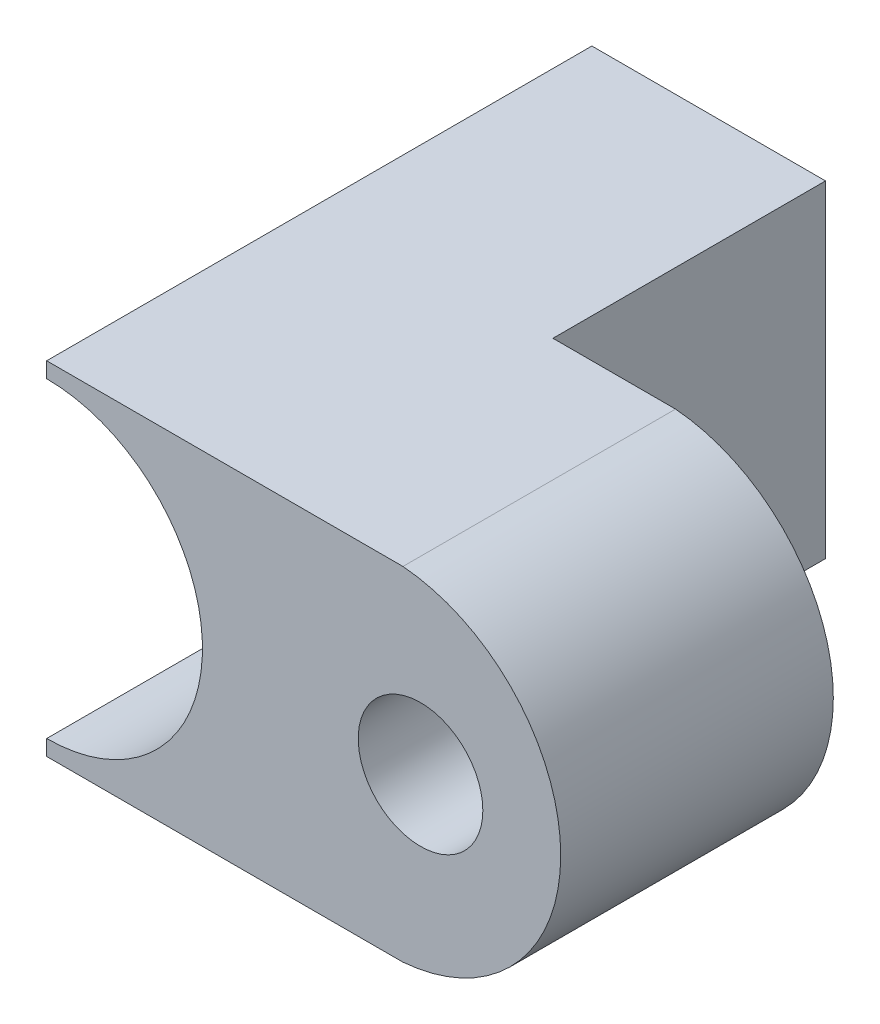
ISO-10303-21;
HEADER;
FILE_DESCRIPTION(('STEP AP214'),'2;1');
FILE_NAME('part.step','',(''),(''),'','','');
FILE_SCHEMA(('AUTOMOTIVE_DESIGN { 1 0 10303 214 1 1 1 1 }'));
ENDSEC;
DATA;
#1=APPLICATION_CONTEXT('core data for automotive mechanical design processes');
#2=APPLICATION_PROTOCOL_DEFINITION('international standard','automotive_design',2000,#1);
#3=PRODUCT_CONTEXT('',#1,'mechanical');
#4=PRODUCT('Part','Part','',(#3));
#5=PRODUCT_RELATED_PRODUCT_CATEGORY('part','',(#4));
#6=PRODUCT_DEFINITION_FORMATION('','',#4);
#7=PRODUCT_DEFINITION_CONTEXT('part definition',#1,'design');
#8=PRODUCT_DEFINITION('design','',#6,#7);
#9=PRODUCT_DEFINITION_SHAPE('','',#8);
#10=(LENGTH_UNIT() NAMED_UNIT(*) SI_UNIT(.MILLI.,.METRE.));
#11=(NAMED_UNIT(*) PLANE_ANGLE_UNIT() SI_UNIT($,.RADIAN.));
#12=(NAMED_UNIT(*) SI_UNIT($,.STERADIAN.) SOLID_ANGLE_UNIT());
#13=UNCERTAINTY_MEASURE_WITH_UNIT(LENGTH_MEASURE(1.E-05),#10,'distance_accuracy_value','');
#14=(GEOMETRIC_REPRESENTATION_CONTEXT(3) GLOBAL_UNCERTAINTY_ASSIGNED_CONTEXT((#13)) GLOBAL_UNIT_ASSIGNED_CONTEXT((#10,
#11,#12)) REPRESENTATION_CONTEXT('',''));
#15=CARTESIAN_POINT('',(0.,0.,0.));
#16=DIRECTION('',(0.,0.,1.));
#17=DIRECTION('',(1.,0.,0.));
#18=AXIS2_PLACEMENT_3D('',#15,#16,#17);
#19=CARTESIAN_POINT('',(27.8923885019855,12.7,44.45));
#20=DIRECTION('',(0.,0.,-1.));
#21=DIRECTION('',(-1.,0.,0.));
#22=AXIS2_PLACEMENT_3D('',#19,#20,#21);
#23=CYLINDRICAL_SURFACE('',#22,14.0176114980145);
#24=CARTESIAN_POINT('',(27.8923885019855,12.7,22.225));
#25=DIRECTION('',(0.,0.,-1.));
#26=DIRECTION('',(-1.,0.,0.));
#27=AXIS2_PLACEMENT_3D('',#24,#25,#26);
#28=CIRCLE('',#27,14.0176114980145);
#29=CARTESIAN_POINT('',(29.0467420480314,26.67,22.225));
#30=VERTEX_POINT('',#29);
#31=CARTESIAN_POINT('',(29.0467420480314,-1.27,22.225));
#32=VERTEX_POINT('',#31);
#33=EDGE_CURVE('E144',#30,#32,#28,.T.);
#34=ORIENTED_EDGE('',*,*,#33,.F.);
#35=DIRECTION('',(0.,0.,-1.));
#36=VECTOR('',#35,1.);
#37=CARTESIAN_POINT('',(29.0467420480314,26.67,44.45));
#38=LINE('',#37,#36);
#39=CARTESIAN_POINT('',(29.0467420480314,26.67,44.45));
#40=VERTEX_POINT('',#39);
#41=EDGE_CURVE('E150',#40,#30,#38,.T.);
#42=ORIENTED_EDGE('',*,*,#41,.F.);
#43=CARTESIAN_POINT('',(27.8923885019855,12.7,44.45));
#44=DIRECTION('',(0.,0.,1.));
#45=DIRECTION('',(1.,0.,0.));
#46=AXIS2_PLACEMENT_3D('',#43,#44,#45);
#47=CIRCLE('',#46,14.0176114980145);
#48=CARTESIAN_POINT('',(29.0467420480314,-1.27,44.45));
#49=VERTEX_POINT('',#48);
#50=EDGE_CURVE('E174',#49,#40,#47,.T.);
#51=ORIENTED_EDGE('',*,*,#50,.F.);
#52=DIRECTION('',(0.,0.,-1.));
#53=VECTOR('',#52,1.);
#54=CARTESIAN_POINT('',(29.0467420480314,-1.27,44.45));
#55=LINE('',#54,#53);
#56=EDGE_CURVE('E200',#49,#32,#55,.T.);
#57=ORIENTED_EDGE('',*,*,#56,.T.);
#58=EDGE_LOOP('',(#34,#42,#51,#57));
#59=FACE_BOUND('',#58,.T.);
#60=ADVANCED_FACE('F53',(#59),#23,.T.);
#61=CARTESIAN_POINT('',(0.,25.4,44.45));
#62=DIRECTION('',(1.,0.,0.));
#63=DIRECTION('',(0.,1.,0.));
#64=AXIS2_PLACEMENT_3D('',#61,#62,#63);
#65=PLANE('',#64);
#66=DIRECTION('',(0.,-1.,0.));
#67=VECTOR('',#66,1.);
#68=CARTESIAN_POINT('',(0.,25.4,0.));
#69=LINE('',#68,#67);
#70=CARTESIAN_POINT('',(0.,26.67,0.));
#71=VERTEX_POINT('',#70);
#72=CARTESIAN_POINT('',(0.,25.4,0.));
#73=VERTEX_POINT('',#72);
#74=EDGE_CURVE('E143',#71,#73,#69,.T.);
#75=ORIENTED_EDGE('',*,*,#74,.T.);
#76=DIRECTION('',(0.,0.,-1.));
#77=VECTOR('',#76,1.);
#78=CARTESIAN_POINT('',(0.,25.4,44.45));
#79=LINE('',#78,#77);
#80=CARTESIAN_POINT('',(0.,25.4,44.45));
#81=VERTEX_POINT('',#80);
#82=EDGE_CURVE('E212',#81,#73,#79,.T.);
#83=ORIENTED_EDGE('',*,*,#82,.F.);
#84=DIRECTION('',(0.,-1.,0.));
#85=VECTOR('',#84,1.);
#86=CARTESIAN_POINT('',(0.,25.4,44.45));
#87=LINE('',#86,#85);
#88=CARTESIAN_POINT('',(0.,26.67,44.45));
#89=VERTEX_POINT('',#88);
#90=EDGE_CURVE('E160',#89,#81,#87,.T.);
#91=ORIENTED_EDGE('',*,*,#90,.F.);
#92=DIRECTION('',(0.,0.,-1.));
#93=VECTOR('',#92,1.);
#94=CARTESIAN_POINT('',(0.,26.67,44.45));
#95=LINE('',#94,#93);
#96=EDGE_CURVE('E180',#89,#71,#95,.T.);
#97=ORIENTED_EDGE('',*,*,#96,.T.);
#98=EDGE_LOOP('',(#75,#83,#91,#97));
#99=FACE_BOUND('',#98,.T.);
#100=ADVANCED_FACE('F235',(#99),#65,.F.);
#101=CARTESIAN_POINT('',(0.,12.7,44.45));
#102=DIRECTION('',(0.,0.,-1.));
#103=DIRECTION('',(-1.,0.,0.));
#104=AXIS2_PLACEMENT_3D('',#101,#102,#103);
#105=CYLINDRICAL_SURFACE('',#104,12.7);
#106=CARTESIAN_POINT('',(0.,12.7,0.));
#107=DIRECTION('',(0.,0.,-1.));
#108=DIRECTION('',(1.,0.,0.));
#109=AXIS2_PLACEMENT_3D('',#106,#107,#108);
#110=CIRCLE('',#109,12.7);
#111=CARTESIAN_POINT('',(0.,0.,0.));
#112=VERTEX_POINT('',#111);
#113=EDGE_CURVE('E184',#73,#112,#110,.T.);
#114=ORIENTED_EDGE('',*,*,#113,.T.);
#115=DIRECTION('',(0.,0.,-1.));
#116=VECTOR('',#115,1.);
#117=CARTESIAN_POINT('',(0.,0.,44.45));
#118=LINE('',#117,#116);
#119=CARTESIAN_POINT('',(0.,0.,44.45));
#120=VERTEX_POINT('',#119);
#121=EDGE_CURVE('E208',#120,#112,#118,.T.);
#122=ORIENTED_EDGE('',*,*,#121,.F.);
#123=CARTESIAN_POINT('',(0.,12.7,44.45));
#124=DIRECTION('',(0.,0.,-1.));
#125=DIRECTION('',(1.,0.,0.));
#126=AXIS2_PLACEMENT_3D('',#123,#124,#125);
#127=CIRCLE('',#126,12.7);
#128=EDGE_CURVE('E164',#81,#120,#127,.T.);
#129=ORIENTED_EDGE('',*,*,#128,.F.);
#130=ORIENTED_EDGE('',*,*,#82,.T.);
#131=EDGE_LOOP('',(#114,#122,#129,#130));
#132=FACE_BOUND('',#131,.T.);
#133=ADVANCED_FACE('F249',(#132),#105,.F.);
#134=CARTESIAN_POINT('',(0.,0.,44.45));
#135=DIRECTION('',(1.,0.,0.));
#136=DIRECTION('',(0.,0.,-1.));
#137=AXIS2_PLACEMENT_3D('',#134,#135,#136);
#138=PLANE('',#137);
#139=DIRECTION('',(0.,-1.,0.));
#140=VECTOR('',#139,1.);
#141=CARTESIAN_POINT('',(0.,0.,0.));
#142=LINE('',#141,#140);
#143=CARTESIAN_POINT('',(0.,-1.27,0.));
#144=VERTEX_POINT('',#143);
#145=EDGE_CURVE('E187',#112,#144,#142,.T.);
#146=ORIENTED_EDGE('',*,*,#145,.T.);
#147=DIRECTION('',(0.,0.,-1.));
#148=VECTOR('',#147,1.);
#149=CARTESIAN_POINT('',(0.,-1.27,44.45));
#150=LINE('',#149,#148);
#151=CARTESIAN_POINT('',(0.,-1.27,44.45));
#152=VERTEX_POINT('',#151);
#153=EDGE_CURVE('E204',#152,#144,#150,.T.);
#154=ORIENTED_EDGE('',*,*,#153,.F.);
#155=DIRECTION('',(0.,-1.,0.));
#156=VECTOR('',#155,1.);
#157=CARTESIAN_POINT('',(0.,0.,44.45));
#158=LINE('',#157,#156);
#159=EDGE_CURVE('E168',#120,#152,#158,.T.);
#160=ORIENTED_EDGE('',*,*,#159,.F.);
#161=ORIENTED_EDGE('',*,*,#121,.T.);
#162=EDGE_LOOP('',(#146,#154,#160,#161));
#163=FACE_BOUND('',#162,.T.);
#164=ADVANCED_FACE('F247',(#163),#138,.F.);
#165=CARTESIAN_POINT('',(0.,-1.27,44.45));
#166=DIRECTION('',(0.,1.,0.));
#167=DIRECTION('',(0.,0.,1.));
#168=AXIS2_PLACEMENT_3D('',#165,#166,#167);
#169=PLANE('',#168);
#170=DIRECTION('',(1.,0.,0.));
#171=VECTOR('',#170,1.);
#172=CARTESIAN_POINT('',(0.,-1.27,0.));
#173=LINE('',#172,#171);
#174=CARTESIAN_POINT('',(17.78,-1.27,0.));
#175=VERTEX_POINT('',#174);
#176=EDGE_CURVE('E190',#144,#175,#173,.T.);
#177=ORIENTED_EDGE('',*,*,#176,.T.);
#178=DIRECTION('',(0.,0.,1.));
#179=VECTOR('',#178,1.);
#180=CARTESIAN_POINT('',(17.78,-1.27,44.45));
#181=LINE('',#180,#179);
#182=CARTESIAN_POINT('',(17.78,-1.27,22.225));
#183=VERTEX_POINT('',#182);
#184=EDGE_CURVE('E63',#175,#183,#181,.T.);
#185=ORIENTED_EDGE('',*,*,#184,.T.);
#186=DIRECTION('',(-1.,0.,0.));
#187=VECTOR('',#186,1.);
#188=CARTESIAN_POINT('',(19.05,-1.27,22.225));
#189=LINE('',#188,#187);
#190=EDGE_CURVE('E69',#32,#183,#189,.T.);
#191=ORIENTED_EDGE('',*,*,#190,.F.);
#192=ORIENTED_EDGE('',*,*,#56,.F.);
#193=DIRECTION('',(1.,0.,0.));
#194=VECTOR('',#193,1.);
#195=CARTESIAN_POINT('',(0.,-1.27,44.45));
#196=LINE('',#195,#194);
#197=EDGE_CURVE('E171',#152,#49,#196,.T.);
#198=ORIENTED_EDGE('',*,*,#197,.F.);
#199=ORIENTED_EDGE('',*,*,#153,.T.);
#200=EDGE_LOOP('',(#177,#185,#191,#192,#198,#199));
#201=FACE_BOUND('',#200,.T.);
#202=ADVANCED_FACE('F227',(#201),#169,.F.);
#203=CARTESIAN_POINT('',(0.,26.67,44.45));
#204=DIRECTION('',(0.,-1.,0.));
#205=DIRECTION('',(1.,0.,0.));
#206=AXIS2_PLACEMENT_3D('',#203,#204,#205);
#207=PLANE('',#206);
#208=DIRECTION('',(1.,0.,0.));
#209=VECTOR('',#208,1.);
#210=CARTESIAN_POINT('',(29.0467420480314,26.67,22.225));
#211=LINE('',#210,#209);
#212=CARTESIAN_POINT('',(19.05,26.67,22.225));
#213=VERTEX_POINT('',#212);
#214=EDGE_CURVE('E128',#213,#30,#211,.T.);
#215=ORIENTED_EDGE('',*,*,#214,.F.);
#216=DIRECTION('',(0.,0.,-1.));
#217=VECTOR('',#216,1.);
#218=CARTESIAN_POINT('',(19.05,26.67,22.225));
#219=LINE('',#218,#217);
#220=CARTESIAN_POINT('',(19.05,26.67,0.));
#221=VERTEX_POINT('',#220);
#222=EDGE_CURVE('E137',#213,#221,#219,.T.);
#223=ORIENTED_EDGE('',*,*,#222,.T.);
#224=DIRECTION('',(-1.,0.,0.));
#225=VECTOR('',#224,1.);
#226=CARTESIAN_POINT('',(0.,26.67,0.));
#227=LINE('',#226,#225);
#228=EDGE_CURVE('E165',#221,#71,#227,.T.);
#229=ORIENTED_EDGE('',*,*,#228,.T.);
#230=ORIENTED_EDGE('',*,*,#96,.F.);
#231=DIRECTION('',(-1.,0.,0.));
#232=VECTOR('',#231,1.);
#233=CARTESIAN_POINT('',(0.,26.67,44.45));
#234=LINE('',#233,#232);
#235=EDGE_CURVE('E177',#40,#89,#234,.T.);
#236=ORIENTED_EDGE('',*,*,#235,.F.);
#237=ORIENTED_EDGE('',*,*,#41,.T.);
#238=EDGE_LOOP('',(#215,#223,#229,#230,#236,#237));
#239=FACE_BOUND('',#238,.T.);
#240=ADVANCED_FACE('F147',(#239),#207,.F.);
#241=CARTESIAN_POINT('',(27.8923885019855,12.7,44.45));
#242=DIRECTION('',(0.,0.,1.));
#243=DIRECTION('',(1.,0.,0.));
#244=AXIS2_PLACEMENT_3D('',#241,#242,#243);
#245=PLANE('',#244);
#246=CARTESIAN_POINT('',(30.48,12.7,44.45));
#247=DIRECTION('',(0.,0.,1.));
#248=DIRECTION('',(1.,0.,0.));
#249=AXIS2_PLACEMENT_3D('',#246,#247,#248);
#250=CIRCLE('',#249,5.08);
#251=CARTESIAN_POINT('',(35.56,12.7,44.45));
#252=VERTEX_POINT('',#251);
#253=EDGE_CURVE('E220',#252,#252,#250,.T.);
#254=ORIENTED_EDGE('',*,*,#253,.F.);
#255=EDGE_LOOP('',(#254));
#256=FACE_BOUND('',#255,.T.);
#257=ORIENTED_EDGE('',*,*,#90,.T.);
#258=ORIENTED_EDGE('',*,*,#128,.T.);
#259=ORIENTED_EDGE('',*,*,#159,.T.);
#260=ORIENTED_EDGE('',*,*,#197,.T.);
#261=ORIENTED_EDGE('',*,*,#50,.T.);
#262=ORIENTED_EDGE('',*,*,#235,.T.);
#263=EDGE_LOOP('',(#257,#258,#259,#260,#261,#262));
#264=FACE_BOUND('',#263,.T.);
#265=ADVANCED_FACE('F238',(#256,#264),#245,.T.);
#266=CARTESIAN_POINT('',(27.8923885019855,12.7,0.));
#267=DIRECTION('',(0.,0.,1.));
#268=DIRECTION('',(1.,0.,0.));
#269=AXIS2_PLACEMENT_3D('',#266,#267,#268);
#270=PLANE('',#269);
#271=DIRECTION('',(0.,1.,0.));
#272=VECTOR('',#271,1.);
#273=CARTESIAN_POINT('',(19.05,-1.27,0.));
#274=LINE('',#273,#272);
#275=CARTESIAN_POINT('',(19.05,0.,0.));
#276=VERTEX_POINT('',#275);
#277=EDGE_CURVE('E139',#276,#221,#274,.T.);
#278=ORIENTED_EDGE('',*,*,#277,.F.);
#279=DIRECTION('',(0.707106781186551,0.707106781186544,0.));
#280=VECTOR('',#279,1.);
#281=CARTESIAN_POINT('',(19.05,0.,0.));
#282=LINE('',#281,#280);
#283=EDGE_CURVE('E77',#276,#175,#282,.F.);
#284=ORIENTED_EDGE('',*,*,#283,.T.);
#285=ORIENTED_EDGE('',*,*,#176,.F.);
#286=ORIENTED_EDGE('',*,*,#145,.F.);
#287=ORIENTED_EDGE('',*,*,#113,.F.);
#288=ORIENTED_EDGE('',*,*,#74,.F.);
#289=ORIENTED_EDGE('',*,*,#228,.F.);
#290=EDGE_LOOP('',(#278,#284,#285,#286,#287,#288,#289));
#291=FACE_BOUND('',#290,.T.);
#292=ADVANCED_FACE('F230',(#291),#270,.F.);
#293=CARTESIAN_POINT('',(19.05,-1.27,22.225));
#294=DIRECTION('',(-1.,0.,0.));
#295=DIRECTION('',(0.,0.,1.));
#296=AXIS2_PLACEMENT_3D('',#293,#294,#295);
#297=PLANE('',#296);
#298=DIRECTION('',(0.,1.,0.));
#299=VECTOR('',#298,1.);
#300=CARTESIAN_POINT('',(19.05,-1.27,22.225));
#301=LINE('',#300,#299);
#302=CARTESIAN_POINT('',(19.05,0.,22.225));
#303=VERTEX_POINT('',#302);
#304=EDGE_CURVE('E124',#303,#213,#301,.T.);
#305=ORIENTED_EDGE('',*,*,#304,.F.);
#306=DIRECTION('',(0.,0.,-1.));
#307=VECTOR('',#306,1.);
#308=CARTESIAN_POINT('',(19.05,0.,22.225));
#309=LINE('',#308,#307);
#310=EDGE_CURVE('E216',#303,#276,#309,.T.);
#311=ORIENTED_EDGE('',*,*,#310,.T.);
#312=ORIENTED_EDGE('',*,*,#277,.T.);
#313=ORIENTED_EDGE('',*,*,#222,.F.);
#314=EDGE_LOOP('',(#305,#311,#312,#313));
#315=FACE_BOUND('',#314,.T.);
#316=ADVANCED_FACE('F138',(#315),#297,.F.);
#317=CARTESIAN_POINT('',(27.8923885019855,12.7,22.225));
#318=DIRECTION('',(0.,0.,-1.));
#319=DIRECTION('',(-1.,0.,0.));
#320=AXIS2_PLACEMENT_3D('',#317,#318,#319);
#321=PLANE('',#320);
#322=CARTESIAN_POINT('',(30.48,12.7,22.225));
#323=DIRECTION('',(0.,0.,-1.));
#324=DIRECTION('',(-1.,0.,0.));
#325=AXIS2_PLACEMENT_3D('',#322,#323,#324);
#326=CIRCLE('',#325,5.07999999999999);
#327=CARTESIAN_POINT('',(25.4,12.7,22.225));
#328=VERTEX_POINT('',#327);
#329=EDGE_CURVE('E158',#328,#328,#326,.T.);
#330=ORIENTED_EDGE('',*,*,#329,.F.);
#331=EDGE_LOOP('',(#330));
#332=FACE_BOUND('',#331,.T.);
#333=ORIENTED_EDGE('',*,*,#190,.T.);
#334=DIRECTION('',(-0.707106781186551,-0.707106781186544,0.));
#335=VECTOR('',#334,1.);
#336=CARTESIAN_POINT('',(19.05,0.,22.225));
#337=LINE('',#336,#335);
#338=EDGE_CURVE('E12',#183,#303,#337,.F.);
#339=ORIENTED_EDGE('',*,*,#338,.T.);
#340=ORIENTED_EDGE('',*,*,#304,.T.);
#341=ORIENTED_EDGE('',*,*,#214,.T.);
#342=ORIENTED_EDGE('',*,*,#33,.T.);
#343=EDGE_LOOP('',(#333,#339,#340,#341,#342));
#344=FACE_BOUND('',#343,.T.);
#345=ADVANCED_FACE('F126',(#332,#344),#321,.T.);
#346=CARTESIAN_POINT('',(30.48,12.7,44.45));
#347=DIRECTION('',(0.,0.,1.));
#348=DIRECTION('',(1.,0.,0.));
#349=AXIS2_PLACEMENT_3D('',#346,#347,#348);
#350=CYLINDRICAL_SURFACE('',#349,5.07999999999999);
#351=ORIENTED_EDGE('',*,*,#329,.T.);
#352=EDGE_LOOP('',(#351));
#353=FACE_BOUND('',#352,.T.);
#354=ORIENTED_EDGE('',*,*,#253,.T.);
#355=EDGE_LOOP('',(#354));
#356=FACE_BOUND('',#355,.T.);
#357=ADVANCED_FACE('F283',(#353,#356),#350,.F.);
#358=CARTESIAN_POINT('',(19.05,0.,22.225));
#359=DIRECTION('',(-0.707106781186544,0.707106781186551,0.));
#360=DIRECTION('',(0.,0.,-1.));
#361=AXIS2_PLACEMENT_3D('',#358,#359,#360);
#362=PLANE('',#361);
#363=ORIENTED_EDGE('',*,*,#338,.F.);
#364=ORIENTED_EDGE('',*,*,#184,.F.);
#365=ORIENTED_EDGE('',*,*,#283,.F.);
#366=ORIENTED_EDGE('',*,*,#310,.F.);
#367=EDGE_LOOP('',(#363,#364,#365,#366));
#368=FACE_BOUND('',#367,.T.);
#369=ADVANCED_FACE('F56',(#368),#362,.F.);
#370=CLOSED_SHELL('',(#60,#100,#133,#164,#202,#240,#265,#292,#316,#345,#357,#369));
#371=MANIFOLD_SOLID_BREP('B2',#370);
#372=ADVANCED_BREP_SHAPE_REPRESENTATION('',(#18,#371),#14);
#373=SHAPE_DEFINITION_REPRESENTATION(#9,#372);
ENDSEC;
END-ISO-10303-21;
